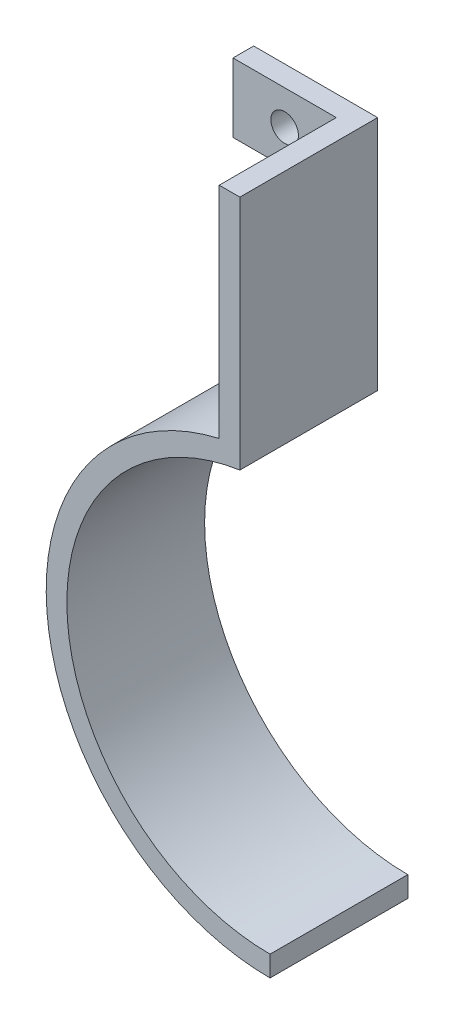
ISO-10303-21;
HEADER;
FILE_DESCRIPTION(('STEP AP214'),'2;1');
FILE_NAME('part.step','',(''),(''),'','','');
FILE_SCHEMA(('AUTOMOTIVE_DESIGN { 1 0 10303 214 1 1 1 1 }'));
ENDSEC;
DATA;
#1=APPLICATION_CONTEXT('core data for automotive mechanical design processes');
#2=APPLICATION_PROTOCOL_DEFINITION('international standard','automotive_design',2000,#1);
#3=PRODUCT_CONTEXT('',#1,'mechanical');
#4=PRODUCT('Part','Part','',(#3));
#5=PRODUCT_RELATED_PRODUCT_CATEGORY('part','',(#4));
#6=PRODUCT_DEFINITION_FORMATION('','',#4);
#7=PRODUCT_DEFINITION_CONTEXT('part definition',#1,'design');
#8=PRODUCT_DEFINITION('design','',#6,#7);
#9=PRODUCT_DEFINITION_SHAPE('','',#8);
#10=(LENGTH_UNIT() NAMED_UNIT(*) SI_UNIT(.MILLI.,.METRE.));
#11=(NAMED_UNIT(*) PLANE_ANGLE_UNIT() SI_UNIT($,.RADIAN.));
#12=(NAMED_UNIT(*) SI_UNIT($,.STERADIAN.) SOLID_ANGLE_UNIT());
#13=UNCERTAINTY_MEASURE_WITH_UNIT(LENGTH_MEASURE(1.E-05),#10,'distance_accuracy_value','');
#14=(GEOMETRIC_REPRESENTATION_CONTEXT(3) GLOBAL_UNCERTAINTY_ASSIGNED_CONTEXT((#13)) GLOBAL_UNIT_ASSIGNED_CONTEXT((#10,
#11,#12)) REPRESENTATION_CONTEXT('',''));
#15=CARTESIAN_POINT('',(0.,0.,0.));
#16=DIRECTION('',(0.,0.,1.));
#17=DIRECTION('',(1.,0.,0.));
#18=AXIS2_PLACEMENT_3D('',#15,#16,#17);
#19=CARTESIAN_POINT('',(-7.37869131641628,-32.501,0.));
#20=DIRECTION('',(-1.,0.,0.));
#21=DIRECTION('',(0.,0.,1.));
#22=AXIS2_PLACEMENT_3D('',#19,#20,#21);
#23=PLANE('',#22);
#24=DIRECTION('',(0.,1.,0.));
#25=VECTOR('',#24,1.);
#26=CARTESIAN_POINT('',(-7.37869131641625,53.5,3.));
#27=LINE('',#26,#25);
#28=CARTESIAN_POINT('',(-7.37869131641625,53.5,3.));
#29=VERTEX_POINT('',#28);
#30=CARTESIAN_POINT('',(-7.37869131641624,63.5,3.));
#31=VERTEX_POINT('',#30);
#32=EDGE_CURVE('E131',#29,#31,#27,.T.);
#33=ORIENTED_EDGE('',*,*,#32,.F.);
#34=DIRECTION('',(0.,0.,1.));
#35=VECTOR('',#34,1.);
#36=CARTESIAN_POINT('',(-7.37869131641625,53.5,3.));
#37=LINE('',#36,#35);
#38=CARTESIAN_POINT('',(-7.37869131641625,53.5,0.));
#39=VERTEX_POINT('',#38);
#40=EDGE_CURVE('E133',#39,#29,#37,.T.);
#41=ORIENTED_EDGE('',*,*,#40,.F.);
#42=DIRECTION('',(0.,1.,0.));
#43=VECTOR('',#42,1.);
#44=CARTESIAN_POINT('',(-7.37869131641628,-32.501,0.));
#45=LINE('',#44,#43);
#46=CARTESIAN_POINT('',(-7.37869131641626,31.651301939368,0.));
#47=VERTEX_POINT('',#46);
#48=EDGE_CURVE('E151',#47,#39,#45,.T.);
#49=ORIENTED_EDGE('',*,*,#48,.F.);
#50=DIRECTION('',(0.,0.,-1.));
#51=VECTOR('',#50,1.);
#52=CARTESIAN_POINT('',(-7.37869131641625,31.651301939368,20.));
#53=LINE('',#52,#51);
#54=CARTESIAN_POINT('',(-7.37869131641625,31.651301939368,20.));
#55=VERTEX_POINT('',#54);
#56=EDGE_CURVE('E152',#47,#55,#53,.F.);
#57=ORIENTED_EDGE('',*,*,#56,.T.);
#58=DIRECTION('',(0.,1.,0.));
#59=VECTOR('',#58,1.);
#60=CARTESIAN_POINT('',(-7.37869131641627,-32.501,20.));
#61=LINE('',#60,#59);
#62=CARTESIAN_POINT('',(-7.37869131641624,63.5,20.));
#63=VERTEX_POINT('',#62);
#64=EDGE_CURVE('E155',#55,#63,#61,.T.);
#65=ORIENTED_EDGE('',*,*,#64,.T.);
#66=DIRECTION('',(0.,0.,1.));
#67=VECTOR('',#66,1.);
#68=CARTESIAN_POINT('',(-7.37869131641624,63.5,0.));
#69=LINE('',#68,#67);
#70=EDGE_CURVE('E116',#31,#63,#69,.T.);
#71=ORIENTED_EDGE('',*,*,#70,.F.);
#72=EDGE_LOOP('',(#33,#41,#49,#57,#65,#71));
#73=FACE_BOUND('',#72,.T.);
#74=ADVANCED_FACE('F35',(#73),#23,.T.);
#75=CARTESIAN_POINT('',(0.,0.,20.));
#76=DIRECTION('',(0.,0.,-1.));
#77=DIRECTION('',(-1.,0.,0.));
#78=AXIS2_PLACEMENT_3D('',#75,#76,#77);
#79=CYLINDRICAL_SURFACE('',#78,29.5);
#80=CARTESIAN_POINT('',(0.,0.,0.));
#81=DIRECTION('',(0.,0.,-1.));
#82=DIRECTION('',(1.,0.,0.));
#83=AXIS2_PLACEMENT_3D('',#80,#81,#82);
#84=CIRCLE('',#83,29.5);
#85=CARTESIAN_POINT('',(0.,-29.5,0.));
#86=VERTEX_POINT('',#85);
#87=CARTESIAN_POINT('',(-4.37869131641625,29.1732250934918,0.));
#88=VERTEX_POINT('',#87);
#89=EDGE_CURVE('E158',#86,#88,#84,.T.);
#90=ORIENTED_EDGE('',*,*,#89,.T.);
#91=DIRECTION('',(0.,0.,-1.));
#92=VECTOR('',#91,1.);
#93=CARTESIAN_POINT('',(-4.37869131641625,29.1732250934918,20.));
#94=LINE('',#93,#92);
#95=CARTESIAN_POINT('',(-4.37869131641625,29.1732250934918,20.));
#96=VERTEX_POINT('',#95);
#97=EDGE_CURVE('E11',#96,#88,#94,.T.);
#98=ORIENTED_EDGE('',*,*,#97,.F.);
#99=CARTESIAN_POINT('',(0.,0.,20.));
#100=DIRECTION('',(0.,0.,-1.));
#101=DIRECTION('',(1.,0.,0.));
#102=AXIS2_PLACEMENT_3D('',#99,#100,#101);
#103=CIRCLE('',#102,29.5);
#104=CARTESIAN_POINT('',(0.,-29.5,20.));
#105=VERTEX_POINT('',#104);
#106=EDGE_CURVE('E160',#105,#96,#103,.T.);
#107=ORIENTED_EDGE('',*,*,#106,.F.);
#108=DIRECTION('',(0.,0.,-1.));
#109=VECTOR('',#108,1.);
#110=CARTESIAN_POINT('',(0.,-29.5,20.));
#111=LINE('',#110,#109);
#112=EDGE_CURVE('E169',#105,#86,#111,.T.);
#113=ORIENTED_EDGE('',*,*,#112,.T.);
#114=EDGE_LOOP('',(#90,#98,#107,#113));
#115=FACE_BOUND('',#114,.T.);
#116=ADVANCED_FACE('F37',(#115),#79,.F.);
#117=CARTESIAN_POINT('',(-4.37869131641625,29.1732250934918,20.));
#118=DIRECTION('',(-1.,0.,0.));
#119=DIRECTION('',(0.,0.,1.));
#120=AXIS2_PLACEMENT_3D('',#117,#118,#119);
#121=PLANE('',#120);
#122=DIRECTION('',(0.,1.,0.));
#123=VECTOR('',#122,1.);
#124=CARTESIAN_POINT('',(-4.37869131641625,29.1732250934918,0.));
#125=LINE('',#124,#123);
#126=CARTESIAN_POINT('',(-4.37869131641624,63.5,0.));
#127=VERTEX_POINT('',#126);
#128=EDGE_CURVE('E172',#88,#127,#125,.T.);
#129=ORIENTED_EDGE('',*,*,#128,.T.);
#130=DIRECTION('',(0.,0.,-1.));
#131=VECTOR('',#130,1.);
#132=CARTESIAN_POINT('',(-4.37869131641624,63.5,20.));
#133=LINE('',#132,#131);
#134=CARTESIAN_POINT('',(-4.37869131641624,63.5,20.));
#135=VERTEX_POINT('',#134);
#136=EDGE_CURVE('E114',#135,#127,#133,.T.);
#137=ORIENTED_EDGE('',*,*,#136,.F.);
#138=DIRECTION('',(0.,1.,0.));
#139=VECTOR('',#138,1.);
#140=CARTESIAN_POINT('',(-4.37869131641625,29.1732250934918,20.));
#141=LINE('',#140,#139);
#142=EDGE_CURVE('E163',#96,#135,#141,.T.);
#143=ORIENTED_EDGE('',*,*,#142,.F.);
#144=ORIENTED_EDGE('',*,*,#97,.T.);
#145=EDGE_LOOP('',(#129,#137,#143,#144));
#146=FACE_BOUND('',#145,.T.);
#147=ADVANCED_FACE('F197',(#146),#121,.F.);
#148=CARTESIAN_POINT('',(0.,0.,20.));
#149=DIRECTION('',(0.,0.,-1.));
#150=DIRECTION('',(-1.,0.,0.));
#151=AXIS2_PLACEMENT_3D('',#148,#149,#150);
#152=CYLINDRICAL_SURFACE('',#151,32.5);
#153=CARTESIAN_POINT('',(0.,0.,20.));
#154=DIRECTION('',(0.,0.,1.));
#155=DIRECTION('',(1.,0.,0.));
#156=AXIS2_PLACEMENT_3D('',#153,#154,#155);
#157=CIRCLE('',#156,32.5);
#158=CARTESIAN_POINT('',(0.,-32.5,20.));
#159=VERTEX_POINT('',#158);
#160=EDGE_CURVE('E58',#55,#159,#157,.T.);
#161=ORIENTED_EDGE('',*,*,#160,.F.);
#162=ORIENTED_EDGE('',*,*,#56,.F.);
#163=CARTESIAN_POINT('',(0.,0.,0.));
#164=DIRECTION('',(0.,0.,1.));
#165=DIRECTION('',(1.,0.,0.));
#166=AXIS2_PLACEMENT_3D('',#163,#164,#165);
#167=CIRCLE('',#166,32.5);
#168=CARTESIAN_POINT('',(0.,-32.5,0.));
#169=VERTEX_POINT('',#168);
#170=EDGE_CURVE('E174',#47,#169,#167,.T.);
#171=ORIENTED_EDGE('',*,*,#170,.T.);
#172=DIRECTION('',(0.,0.,-1.));
#173=VECTOR('',#172,1.);
#174=CARTESIAN_POINT('',(0.,-32.5,20.));
#175=LINE('',#174,#173);
#176=EDGE_CURVE('E43',#159,#169,#175,.T.);
#177=ORIENTED_EDGE('',*,*,#176,.F.);
#178=EDGE_LOOP('',(#161,#162,#171,#177));
#179=FACE_BOUND('',#178,.T.);
#180=ADVANCED_FACE('F195',(#179),#152,.T.);
#181=CARTESIAN_POINT('',(0.,-29.5,20.));
#182=DIRECTION('',(-1.,0.,0.));
#183=DIRECTION('',(0.,-1.,0.));
#184=AXIS2_PLACEMENT_3D('',#181,#182,#183);
#185=PLANE('',#184);
#186=DIRECTION('',(0.,1.,0.));
#187=VECTOR('',#186,1.);
#188=CARTESIAN_POINT('',(0.,-29.5,0.));
#189=LINE('',#188,#187);
#190=EDGE_CURVE('E164',#169,#86,#189,.T.);
#191=ORIENTED_EDGE('',*,*,#190,.T.);
#192=ORIENTED_EDGE('',*,*,#112,.F.);
#193=DIRECTION('',(0.,1.,0.));
#194=VECTOR('',#193,1.);
#195=CARTESIAN_POINT('',(0.,-29.5,20.));
#196=LINE('',#195,#194);
#197=EDGE_CURVE('E167',#159,#105,#196,.T.);
#198=ORIENTED_EDGE('',*,*,#197,.F.);
#199=ORIENTED_EDGE('',*,*,#176,.T.);
#200=EDGE_LOOP('',(#191,#192,#198,#199));
#201=FACE_BOUND('',#200,.T.);
#202=ADVANCED_FACE('F182',(#201),#185,.F.);
#203=CARTESIAN_POINT('',(0.,0.,20.));
#204=DIRECTION('',(0.,0.,1.));
#205=DIRECTION('',(1.,0.,0.));
#206=AXIS2_PLACEMENT_3D('',#203,#204,#205);
#207=PLANE('',#206);
#208=ORIENTED_EDGE('',*,*,#106,.T.);
#209=ORIENTED_EDGE('',*,*,#142,.T.);
#210=DIRECTION('',(1.,0.,0.));
#211=VECTOR('',#210,1.);
#212=CARTESIAN_POINT('',(-7.37869131641624,63.5,20.));
#213=LINE('',#212,#211);
#214=EDGE_CURVE('E147',#63,#135,#213,.T.);
#215=ORIENTED_EDGE('',*,*,#214,.F.);
#216=ORIENTED_EDGE('',*,*,#64,.F.);
#217=ORIENTED_EDGE('',*,*,#160,.T.);
#218=ORIENTED_EDGE('',*,*,#197,.T.);
#219=EDGE_LOOP('',(#208,#209,#215,#216,#217,#218));
#220=FACE_BOUND('',#219,.T.);
#221=ADVANCED_FACE('F188',(#220),#207,.T.);
#222=CARTESIAN_POINT('',(0.,0.,0.));
#223=DIRECTION('',(0.,0.,1.));
#224=DIRECTION('',(1.,0.,0.));
#225=AXIS2_PLACEMENT_3D('',#222,#223,#224);
#226=PLANE('',#225);
#227=CARTESIAN_POINT('',(-14.8786913164162,58.5,0.));
#228=DIRECTION('',(0.,0.,1.));
#229=DIRECTION('',(1.,0.,0.));
#230=AXIS2_PLACEMENT_3D('',#227,#228,#229);
#231=CIRCLE('',#230,2.);
#232=CARTESIAN_POINT('',(-12.8786913164162,58.5,0.));
#233=VERTEX_POINT('',#232);
#234=EDGE_CURVE('E136',#233,#233,#231,.F.);
#235=ORIENTED_EDGE('',*,*,#234,.F.);
#236=EDGE_LOOP('',(#235));
#237=FACE_BOUND('',#236,.T.);
#238=ORIENTED_EDGE('',*,*,#89,.F.);
#239=ORIENTED_EDGE('',*,*,#190,.F.);
#240=ORIENTED_EDGE('',*,*,#170,.F.);
#241=ORIENTED_EDGE('',*,*,#48,.T.);
#242=DIRECTION('',(1.,0.,0.));
#243=VECTOR('',#242,1.);
#244=CARTESIAN_POINT('',(-22.3786913164162,53.5,0.));
#245=LINE('',#244,#243);
#246=CARTESIAN_POINT('',(-22.3786913164162,53.5,0.));
#247=VERTEX_POINT('',#246);
#248=EDGE_CURVE('E123',#247,#39,#245,.T.);
#249=ORIENTED_EDGE('',*,*,#248,.F.);
#250=DIRECTION('',(0.,-1.,0.));
#251=VECTOR('',#250,1.);
#252=CARTESIAN_POINT('',(-22.3786913164162,63.5,0.));
#253=LINE('',#252,#251);
#254=CARTESIAN_POINT('',(-22.3786913164162,63.5,0.));
#255=VERTEX_POINT('',#254);
#256=EDGE_CURVE('E119',#255,#247,#253,.T.);
#257=ORIENTED_EDGE('',*,*,#256,.F.);
#258=DIRECTION('',(-1.,0.,0.));
#259=VECTOR('',#258,1.);
#260=CARTESIAN_POINT('',(-4.37869131641624,63.5,0.));
#261=LINE('',#260,#259);
#262=EDGE_CURVE('E107',#127,#255,#261,.T.);
#263=ORIENTED_EDGE('',*,*,#262,.F.);
#264=ORIENTED_EDGE('',*,*,#128,.F.);
#265=EDGE_LOOP('',(#238,#239,#240,#241,#249,#257,#263,#264));
#266=FACE_BOUND('',#265,.T.);
#267=ADVANCED_FACE('F121',(#237,#266),#226,.F.);
#268=CARTESIAN_POINT('',(0.,63.5,0.));
#269=DIRECTION('',(0.,1.,0.));
#270=DIRECTION('',(0.,0.,1.));
#271=AXIS2_PLACEMENT_3D('',#268,#269,#270);
#272=PLANE('',#271);
#273=ORIENTED_EDGE('',*,*,#214,.T.);
#274=ORIENTED_EDGE('',*,*,#136,.T.);
#275=ORIENTED_EDGE('',*,*,#262,.T.);
#276=DIRECTION('',(0.,0.,-1.));
#277=VECTOR('',#276,1.);
#278=CARTESIAN_POINT('',(-22.3786913164162,63.5,3.));
#279=LINE('',#278,#277);
#280=CARTESIAN_POINT('',(-22.3786913164162,63.5,3.));
#281=VERTEX_POINT('',#280);
#282=EDGE_CURVE('E112',#281,#255,#279,.T.);
#283=ORIENTED_EDGE('',*,*,#282,.F.);
#284=DIRECTION('',(1.,0.,0.));
#285=VECTOR('',#284,1.);
#286=CARTESIAN_POINT('',(-22.3786913164162,63.5,3.));
#287=LINE('',#286,#285);
#288=EDGE_CURVE('E50',#281,#31,#287,.T.);
#289=ORIENTED_EDGE('',*,*,#288,.T.);
#290=ORIENTED_EDGE('',*,*,#70,.T.);
#291=EDGE_LOOP('',(#273,#274,#275,#283,#289,#290));
#292=FACE_BOUND('',#291,.T.);
#293=ADVANCED_FACE('F110',(#292),#272,.T.);
#294=CARTESIAN_POINT('',(-22.3786913164162,53.5,3.00000000000001));
#295=DIRECTION('',(0.,1.,0.));
#296=DIRECTION('',(-1.,0.,0.));
#297=AXIS2_PLACEMENT_3D('',#294,#295,#296);
#298=PLANE('',#297);
#299=ORIENTED_EDGE('',*,*,#40,.T.);
#300=DIRECTION('',(1.,0.,0.));
#301=VECTOR('',#300,1.);
#302=CARTESIAN_POINT('',(-22.3786913164162,53.5,3.00000000000001));
#303=LINE('',#302,#301);
#304=CARTESIAN_POINT('',(-22.3786913164162,53.5,3.00000000000001));
#305=VERTEX_POINT('',#304);
#306=EDGE_CURVE('E143',#305,#29,#303,.T.);
#307=ORIENTED_EDGE('',*,*,#306,.F.);
#308=DIRECTION('',(0.,0.,1.));
#309=VECTOR('',#308,1.);
#310=CARTESIAN_POINT('',(-22.3786913164162,53.5,3.00000000000001));
#311=LINE('',#310,#309);
#312=EDGE_CURVE('E126',#247,#305,#311,.T.);
#313=ORIENTED_EDGE('',*,*,#312,.F.);
#314=ORIENTED_EDGE('',*,*,#248,.T.);
#315=EDGE_LOOP('',(#299,#307,#313,#314));
#316=FACE_BOUND('',#315,.T.);
#317=ADVANCED_FACE('F220',(#316),#298,.F.);
#318=CARTESIAN_POINT('',(-22.3786913164162,53.5,3.00000000000001));
#319=DIRECTION('',(0.,0.,-1.));
#320=DIRECTION('',(-1.,0.,0.));
#321=AXIS2_PLACEMENT_3D('',#318,#319,#320);
#322=PLANE('',#321);
#323=CARTESIAN_POINT('',(-14.8786913164162,58.5,3.00000000000002));
#324=DIRECTION('',(0.,0.,1.));
#325=DIRECTION('',(1.,0.,0.));
#326=AXIS2_PLACEMENT_3D('',#323,#324,#325);
#327=CIRCLE('',#326,2.);
#328=CARTESIAN_POINT('',(-12.8786913164162,58.5,3.00000000000002));
#329=VERTEX_POINT('',#328);
#330=EDGE_CURVE('E224',#329,#329,#327,.T.);
#331=ORIENTED_EDGE('',*,*,#330,.F.);
#332=EDGE_LOOP('',(#331));
#333=FACE_BOUND('',#332,.T.);
#334=ORIENTED_EDGE('',*,*,#32,.T.);
#335=ORIENTED_EDGE('',*,*,#288,.F.);
#336=DIRECTION('',(0.,1.,0.));
#337=VECTOR('',#336,1.);
#338=CARTESIAN_POINT('',(-22.3786913164162,53.5,3.00000000000001));
#339=LINE('',#338,#337);
#340=EDGE_CURVE('E130',#305,#281,#339,.T.);
#341=ORIENTED_EDGE('',*,*,#340,.F.);
#342=ORIENTED_EDGE('',*,*,#306,.T.);
#343=EDGE_LOOP('',(#334,#335,#341,#342));
#344=FACE_BOUND('',#343,.T.);
#345=ADVANCED_FACE('F230',(#333,#344),#322,.F.);
#346=CARTESIAN_POINT('',(-22.3786913164163,0.,0.));
#347=DIRECTION('',(-1.,0.,0.));
#348=DIRECTION('',(0.,0.,1.));
#349=AXIS2_PLACEMENT_3D('',#346,#347,#348);
#350=PLANE('',#349);
#351=ORIENTED_EDGE('',*,*,#282,.T.);
#352=ORIENTED_EDGE('',*,*,#256,.T.);
#353=ORIENTED_EDGE('',*,*,#312,.T.);
#354=ORIENTED_EDGE('',*,*,#340,.T.);
#355=EDGE_LOOP('',(#351,#352,#353,#354));
#356=FACE_BOUND('',#355,.T.);
#357=ADVANCED_FACE('F128',(#356),#350,.T.);
#358=CARTESIAN_POINT('',(-14.8786913164162,58.5,-5.65685424949238));
#359=DIRECTION('',(0.,0.,1.));
#360=DIRECTION('',(1.,0.,0.));
#361=AXIS2_PLACEMENT_3D('',#358,#359,#360);
#362=CYLINDRICAL_SURFACE('',#361,2.);
#363=ORIENTED_EDGE('',*,*,#234,.T.);
#364=EDGE_LOOP('',(#363));
#365=FACE_BOUND('',#364,.T.);
#366=ORIENTED_EDGE('',*,*,#330,.T.);
#367=EDGE_LOOP('',(#366));
#368=FACE_BOUND('',#367,.T.);
#369=ADVANCED_FACE('F228',(#365,#368),#362,.F.);
#370=CLOSED_SHELL('',(#74,#116,#147,#180,#202,#221,#267,#293,#317,#345,#357,#369));
#371=MANIFOLD_SOLID_BREP('B2',#370);
#372=ADVANCED_BREP_SHAPE_REPRESENTATION('',(#18,#371),#14);
#373=SHAPE_DEFINITION_REPRESENTATION(#9,#372);
ENDSEC;
END-ISO-10303-21;
